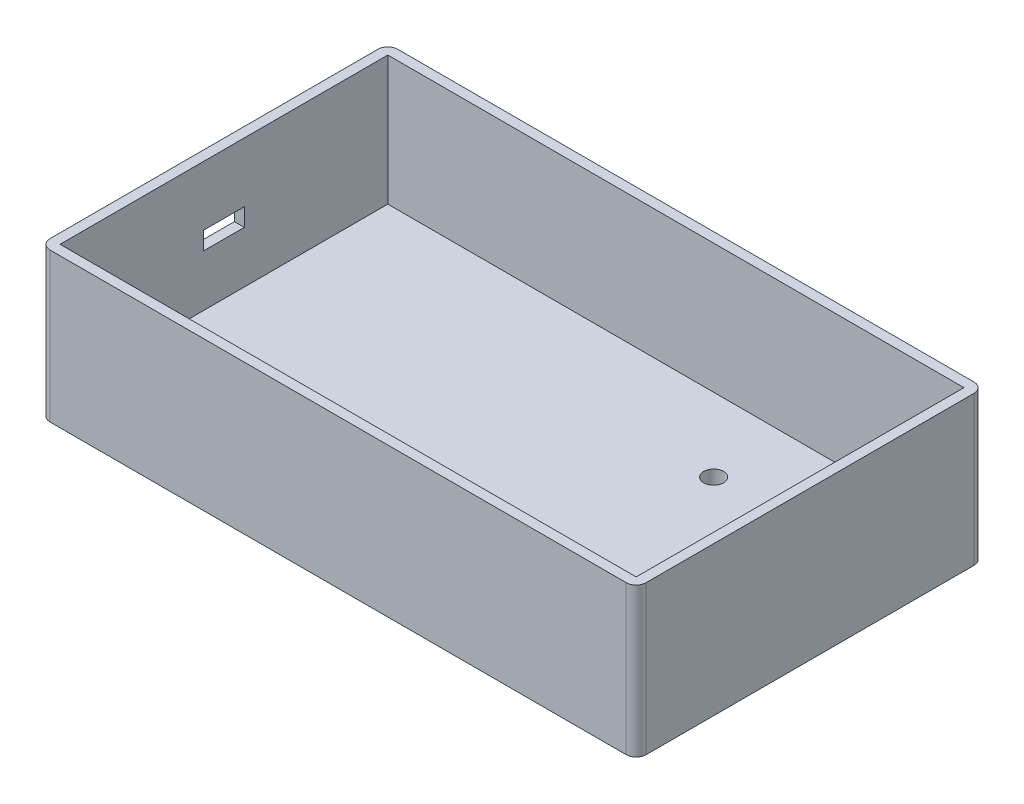
ISO-10303-21;
HEADER;
FILE_DESCRIPTION(('STEP AP214'),'2;1');
FILE_NAME('part.step','',(''),(''),'','','');
FILE_SCHEMA(('AUTOMOTIVE_DESIGN { 1 0 10303 214 1 1 1 1 }'));
ENDSEC;
DATA;
#1=APPLICATION_CONTEXT('core data for automotive mechanical design processes');
#2=APPLICATION_PROTOCOL_DEFINITION('international standard','automotive_design',2000,#1);
#3=PRODUCT_CONTEXT('',#1,'mechanical');
#4=PRODUCT('Part','Part','',(#3));
#5=PRODUCT_RELATED_PRODUCT_CATEGORY('part','',(#4));
#6=PRODUCT_DEFINITION_FORMATION('','',#4);
#7=PRODUCT_DEFINITION_CONTEXT('part definition',#1,'design');
#8=PRODUCT_DEFINITION('design','',#6,#7);
#9=PRODUCT_DEFINITION_SHAPE('','',#8);
#10=(LENGTH_UNIT() NAMED_UNIT(*) SI_UNIT(.MILLI.,.METRE.));
#11=(NAMED_UNIT(*) PLANE_ANGLE_UNIT() SI_UNIT($,.RADIAN.));
#12=(NAMED_UNIT(*) SI_UNIT($,.STERADIAN.) SOLID_ANGLE_UNIT());
#13=UNCERTAINTY_MEASURE_WITH_UNIT(LENGTH_MEASURE(1.E-05),#10,'distance_accuracy_value','');
#14=(GEOMETRIC_REPRESENTATION_CONTEXT(3) GLOBAL_UNCERTAINTY_ASSIGNED_CONTEXT((#13)) GLOBAL_UNIT_ASSIGNED_CONTEXT((#10,
#11,#12)) REPRESENTATION_CONTEXT('',''));
#15=CARTESIAN_POINT('',(0.,0.,0.));
#16=DIRECTION('',(0.,0.,1.));
#17=DIRECTION('',(1.,0.,0.));
#18=AXIS2_PLACEMENT_3D('',#15,#16,#17);
#19=CARTESIAN_POINT('',(76.2,38.1,44.45));
#20=DIRECTION('',(-1.,0.,0.));
#21=DIRECTION('',(0.,0.,1.));
#22=AXIS2_PLACEMENT_3D('',#19,#20,#21);
#23=PLANE('',#22);
#24=DIRECTION('',(0.,0.,-1.));
#25=VECTOR('',#24,1.);
#26=CARTESIAN_POINT('',(76.2,38.1,44.45));
#27=LINE('',#26,#25);
#28=CARTESIAN_POINT('',(76.2,38.1,41.91));
#29=VERTEX_POINT('',#28);
#30=CARTESIAN_POINT('',(76.2,38.1,-41.91));
#31=VERTEX_POINT('',#30);
#32=EDGE_CURVE('E231',#29,#31,#27,.T.);
#33=ORIENTED_EDGE('',*,*,#32,.F.);
#34=DIRECTION('',(0.,-1.,0.));
#35=VECTOR('',#34,1.);
#36=CARTESIAN_POINT('',(76.2,38.1,41.91));
#37=LINE('',#36,#35);
#38=CARTESIAN_POINT('',(76.2,0.,41.91));
#39=VERTEX_POINT('',#38);
#40=EDGE_CURVE('E11',#29,#39,#37,.T.);
#41=ORIENTED_EDGE('',*,*,#40,.T.);
#42=DIRECTION('',(0.,0.,-1.));
#43=VECTOR('',#42,1.);
#44=CARTESIAN_POINT('',(76.2,0.,44.45));
#45=LINE('',#44,#43);
#46=CARTESIAN_POINT('',(76.2,0.,-41.91));
#47=VERTEX_POINT('',#46);
#48=EDGE_CURVE('E224',#39,#47,#45,.T.);
#49=ORIENTED_EDGE('',*,*,#48,.T.);
#50=DIRECTION('',(0.,-1.,0.));
#51=VECTOR('',#50,1.);
#52=CARTESIAN_POINT('',(76.2,38.1,-41.91));
#53=LINE('',#52,#51);
#54=EDGE_CURVE('E53',#47,#31,#53,.F.);
#55=ORIENTED_EDGE('',*,*,#54,.T.);
#56=EDGE_LOOP('',(#33,#41,#49,#55));
#57=FACE_BOUND('',#56,.T.);
#58=ADVANCED_FACE('F45',(#57),#23,.F.);
#59=CARTESIAN_POINT('',(-76.2,38.1,-44.45));
#60=DIRECTION('',(0.,0.,1.));
#61=DIRECTION('',(1.,0.,0.));
#62=AXIS2_PLACEMENT_3D('',#59,#60,#61);
#63=PLANE('',#62);
#64=DIRECTION('',(-1.,0.,0.));
#65=VECTOR('',#64,1.);
#66=CARTESIAN_POINT('',(-76.2,0.,-44.45));
#67=LINE('',#66,#65);
#68=CARTESIAN_POINT('',(73.66,0.,-44.45));
#69=VERTEX_POINT('',#68);
#70=CARTESIAN_POINT('',(-73.66,0.,-44.45));
#71=VERTEX_POINT('',#70);
#72=EDGE_CURVE('E245',#69,#71,#67,.T.);
#73=ORIENTED_EDGE('',*,*,#72,.T.);
#74=DIRECTION('',(0.,-1.,0.));
#75=VECTOR('',#74,1.);
#76=CARTESIAN_POINT('',(-73.66,38.1,-44.45));
#77=LINE('',#76,#75);
#78=CARTESIAN_POINT('',(-73.66,38.1,-44.45));
#79=VERTEX_POINT('',#78);
#80=EDGE_CURVE('E60',#71,#79,#77,.F.);
#81=ORIENTED_EDGE('',*,*,#80,.T.);
#82=DIRECTION('',(-1.,0.,0.));
#83=VECTOR('',#82,1.);
#84=CARTESIAN_POINT('',(-76.2,38.1,-44.45));
#85=LINE('',#84,#83);
#86=CARTESIAN_POINT('',(73.66,38.1,-44.45));
#87=VERTEX_POINT('',#86);
#88=EDGE_CURVE('E233',#87,#79,#85,.T.);
#89=ORIENTED_EDGE('',*,*,#88,.F.);
#90=DIRECTION('',(0.,-1.,0.));
#91=VECTOR('',#90,1.);
#92=CARTESIAN_POINT('',(73.66,38.1,-44.45));
#93=LINE('',#92,#91);
#94=EDGE_CURVE('E276',#87,#69,#93,.T.);
#95=ORIENTED_EDGE('',*,*,#94,.T.);
#96=EDGE_LOOP('',(#73,#81,#89,#95));
#97=FACE_BOUND('',#96,.T.);
#98=ADVANCED_FACE('F289',(#97),#63,.F.);
#99=CARTESIAN_POINT('',(-76.2,38.1,44.45));
#100=DIRECTION('',(1.,0.,0.));
#101=DIRECTION('',(0.,0.,-1.));
#102=AXIS2_PLACEMENT_3D('',#99,#100,#101);
#103=PLANE('',#102);
#104=DIRECTION('',(0.,0.,-1.));
#105=VECTOR('',#104,1.);
#106=CARTESIAN_POINT('',(-76.2,22.86,-5.207));
#107=LINE('',#106,#105);
#108=CARTESIAN_POINT('',(-76.2,22.86,5.207));
#109=VERTEX_POINT('',#108);
#110=CARTESIAN_POINT('',(-76.2,22.86,-5.207));
#111=VERTEX_POINT('',#110);
#112=EDGE_CURVE('E176',#109,#111,#107,.T.);
#113=ORIENTED_EDGE('',*,*,#112,.F.);
#114=DIRECTION('',(0.,1.,0.));
#115=VECTOR('',#114,1.);
#116=CARTESIAN_POINT('',(-76.2,18.288,5.207));
#117=LINE('',#116,#115);
#118=CARTESIAN_POINT('',(-76.2,18.288,5.207));
#119=VERTEX_POINT('',#118);
#120=EDGE_CURVE('E181',#119,#109,#117,.T.);
#121=ORIENTED_EDGE('',*,*,#120,.F.);
#122=DIRECTION('',(0.,0.,1.));
#123=VECTOR('',#122,1.);
#124=CARTESIAN_POINT('',(-76.2,18.288,-5.207));
#125=LINE('',#124,#123);
#126=CARTESIAN_POINT('',(-76.2,18.288,-5.207));
#127=VERTEX_POINT('',#126);
#128=EDGE_CURVE('E186',#127,#119,#125,.T.);
#129=ORIENTED_EDGE('',*,*,#128,.F.);
#130=DIRECTION('',(0.,-1.,0.));
#131=VECTOR('',#130,1.);
#132=CARTESIAN_POINT('',(-76.2,18.288,-5.207));
#133=LINE('',#132,#131);
#134=EDGE_CURVE('E165',#111,#127,#133,.T.);
#135=ORIENTED_EDGE('',*,*,#134,.F.);
#136=EDGE_LOOP('',(#113,#121,#129,#135));
#137=FACE_BOUND('',#136,.T.);
#138=DIRECTION('',(0.,0.,1.));
#139=VECTOR('',#138,1.);
#140=CARTESIAN_POINT('',(-76.2,0.,44.45));
#141=LINE('',#140,#139);
#142=CARTESIAN_POINT('',(-76.2,0.,-41.91));
#143=VERTEX_POINT('',#142);
#144=CARTESIAN_POINT('',(-76.2,0.,41.91));
#145=VERTEX_POINT('',#144);
#146=EDGE_CURVE('E247',#143,#145,#141,.T.);
#147=ORIENTED_EDGE('',*,*,#146,.T.);
#148=DIRECTION('',(0.,-1.,0.));
#149=VECTOR('',#148,1.);
#150=CARTESIAN_POINT('',(-76.2,38.1,41.91));
#151=LINE('',#150,#149);
#152=CARTESIAN_POINT('',(-76.2,38.1,41.91));
#153=VERTEX_POINT('',#152);
#154=EDGE_CURVE('E267',#145,#153,#151,.F.);
#155=ORIENTED_EDGE('',*,*,#154,.T.);
#156=DIRECTION('',(0.,0.,1.));
#157=VECTOR('',#156,1.);
#158=CARTESIAN_POINT('',(-76.2,38.1,44.45));
#159=LINE('',#158,#157);
#160=CARTESIAN_POINT('',(-76.2,38.1,-41.91));
#161=VERTEX_POINT('',#160);
#162=EDGE_CURVE('E236',#161,#153,#159,.T.);
#163=ORIENTED_EDGE('',*,*,#162,.F.);
#164=DIRECTION('',(0.,-1.,0.));
#165=VECTOR('',#164,1.);
#166=CARTESIAN_POINT('',(-76.2,38.1,-41.91));
#167=LINE('',#166,#165);
#168=EDGE_CURVE('E264',#161,#143,#167,.T.);
#169=ORIENTED_EDGE('',*,*,#168,.T.);
#170=EDGE_LOOP('',(#147,#155,#163,#169));
#171=FACE_BOUND('',#170,.T.);
#172=ADVANCED_FACE('F183',(#137,#171),#103,.F.);
#173=CARTESIAN_POINT('',(-76.2,38.1,44.45));
#174=DIRECTION('',(0.,0.,-1.));
#175=DIRECTION('',(-1.,0.,0.));
#176=AXIS2_PLACEMENT_3D('',#173,#174,#175);
#177=PLANE('',#176);
#178=DIRECTION('',(1.,0.,0.));
#179=VECTOR('',#178,1.);
#180=CARTESIAN_POINT('',(-76.2,38.1,44.45));
#181=LINE('',#180,#179);
#182=CARTESIAN_POINT('',(-73.66,38.1,44.45));
#183=VERTEX_POINT('',#182);
#184=CARTESIAN_POINT('',(73.66,38.1,44.45));
#185=VERTEX_POINT('',#184);
#186=EDGE_CURVE('E239',#183,#185,#181,.T.);
#187=ORIENTED_EDGE('',*,*,#186,.F.);
#188=DIRECTION('',(0.,-1.,0.));
#189=VECTOR('',#188,1.);
#190=CARTESIAN_POINT('',(-73.66,38.1,44.45));
#191=LINE('',#190,#189);
#192=CARTESIAN_POINT('',(-73.66,0.,44.45));
#193=VERTEX_POINT('',#192);
#194=EDGE_CURVE('E253',#183,#193,#191,.T.);
#195=ORIENTED_EDGE('',*,*,#194,.T.);
#196=DIRECTION('',(1.,0.,0.));
#197=VECTOR('',#196,1.);
#198=CARTESIAN_POINT('',(-76.2,0.,44.45));
#199=LINE('',#198,#197);
#200=CARTESIAN_POINT('',(73.66,0.,44.45));
#201=VERTEX_POINT('',#200);
#202=EDGE_CURVE('E234',#193,#201,#199,.T.);
#203=ORIENTED_EDGE('',*,*,#202,.T.);
#204=DIRECTION('',(0.,-1.,0.));
#205=VECTOR('',#204,1.);
#206=CARTESIAN_POINT('',(73.66,38.1,44.45));
#207=LINE('',#206,#205);
#208=EDGE_CURVE('E242',#201,#185,#207,.F.);
#209=ORIENTED_EDGE('',*,*,#208,.T.);
#210=EDGE_LOOP('',(#187,#195,#203,#209));
#211=FACE_BOUND('',#210,.T.);
#212=ADVANCED_FACE('F306',(#211),#177,.F.);
#213=CARTESIAN_POINT('',(0.,38.1,0.));
#214=DIRECTION('',(0.,-1.,0.));
#215=DIRECTION('',(0.,0.,-1.));
#216=AXIS2_PLACEMENT_3D('',#213,#214,#215);
#217=PLANE('',#216);
#218=DIRECTION('',(-1.,0.,0.));
#219=VECTOR('',#218,1.);
#220=CARTESIAN_POINT('',(-73.66,38.1,-41.91));
#221=LINE('',#220,#219);
#222=CARTESIAN_POINT('',(73.66,38.1,-41.91));
#223=VERTEX_POINT('',#222);
#224=CARTESIAN_POINT('',(-73.66,38.1,-41.91));
#225=VERTEX_POINT('',#224);
#226=EDGE_CURVE('E214',#223,#225,#221,.T.);
#227=ORIENTED_EDGE('',*,*,#226,.F.);
#228=DIRECTION('',(0.,0.,-1.));
#229=VECTOR('',#228,1.);
#230=CARTESIAN_POINT('',(73.66,38.1,41.91));
#231=LINE('',#230,#229);
#232=CARTESIAN_POINT('',(73.66,38.1,41.91));
#233=VERTEX_POINT('',#232);
#234=EDGE_CURVE('E197',#233,#223,#231,.T.);
#235=ORIENTED_EDGE('',*,*,#234,.F.);
#236=DIRECTION('',(1.,0.,0.));
#237=VECTOR('',#236,1.);
#238=CARTESIAN_POINT('',(-73.66,38.1,41.91));
#239=LINE('',#238,#237);
#240=CARTESIAN_POINT('',(-73.66,38.1,41.91));
#241=VERTEX_POINT('',#240);
#242=EDGE_CURVE('E203',#241,#233,#239,.T.);
#243=ORIENTED_EDGE('',*,*,#242,.F.);
#244=DIRECTION('',(0.,0.,1.));
#245=VECTOR('',#244,1.);
#246=CARTESIAN_POINT('',(-73.66,38.1,41.91));
#247=LINE('',#246,#245);
#248=EDGE_CURVE('E217',#225,#241,#247,.T.);
#249=ORIENTED_EDGE('',*,*,#248,.F.);
#250=EDGE_LOOP('',(#227,#235,#243,#249));
#251=FACE_BOUND('',#250,.T.);
#252=ORIENTED_EDGE('',*,*,#162,.T.);
#253=CARTESIAN_POINT('',(-73.66,38.1,41.91));
#254=DIRECTION('',(0.,-1.,0.));
#255=DIRECTION('',(0.,0.,-1.));
#256=AXIS2_PLACEMENT_3D('',#253,#254,#255);
#257=CIRCLE('',#256,2.54);
#258=EDGE_CURVE('E274',#153,#183,#257,.F.);
#259=ORIENTED_EDGE('',*,*,#258,.T.);
#260=ORIENTED_EDGE('',*,*,#186,.T.);
#261=CARTESIAN_POINT('',(73.66,38.1,41.91));
#262=DIRECTION('',(0.,-1.,0.));
#263=DIRECTION('',(0.,0.,-1.));
#264=AXIS2_PLACEMENT_3D('',#261,#262,#263);
#265=CIRCLE('',#264,2.54);
#266=EDGE_CURVE('E270',#185,#29,#265,.F.);
#267=ORIENTED_EDGE('',*,*,#266,.T.);
#268=ORIENTED_EDGE('',*,*,#32,.T.);
#269=CARTESIAN_POINT('',(73.66,38.1,-41.91));
#270=DIRECTION('',(0.,-1.,0.));
#271=DIRECTION('',(0.,0.,-1.));
#272=AXIS2_PLACEMENT_3D('',#269,#270,#271);
#273=CIRCLE('',#272,2.54);
#274=EDGE_CURVE('E67',#31,#87,#273,.F.);
#275=ORIENTED_EDGE('',*,*,#274,.T.);
#276=ORIENTED_EDGE('',*,*,#88,.T.);
#277=CARTESIAN_POINT('',(-73.66,38.1,-41.91));
#278=DIRECTION('',(0.,-1.,0.));
#279=DIRECTION('',(0.,0.,-1.));
#280=AXIS2_PLACEMENT_3D('',#277,#278,#279);
#281=CIRCLE('',#280,2.54);
#282=EDGE_CURVE('E272',#79,#161,#281,.F.);
#283=ORIENTED_EDGE('',*,*,#282,.T.);
#284=EDGE_LOOP('',(#252,#259,#260,#267,#268,#275,#276,#283));
#285=FACE_BOUND('',#284,.T.);
#286=ADVANCED_FACE('F285',(#251,#285),#217,.F.);
#287=CARTESIAN_POINT('',(0.,0.,0.));
#288=DIRECTION('',(0.,-1.,0.));
#289=DIRECTION('',(0.,0.,-1.));
#290=AXIS2_PLACEMENT_3D('',#287,#288,#289);
#291=PLANE('',#290);
#292=CARTESIAN_POINT('',(28.448,0.,-23.114));
#293=DIRECTION('',(0.,1.,0.));
#294=DIRECTION('',(0.,0.,1.));
#295=AXIS2_PLACEMENT_3D('',#292,#293,#294);
#296=CIRCLE('',#295,2.54);
#297=CARTESIAN_POINT('',(28.448,0.,-20.574));
#298=VERTEX_POINT('',#297);
#299=EDGE_CURVE('E489',#298,#298,#296,.T.);
#300=ORIENTED_EDGE('',*,*,#299,.T.);
#301=EDGE_LOOP('',(#300));
#302=FACE_BOUND('',#301,.T.);
#303=CARTESIAN_POINT('',(28.448,0.,23.114));
#304=DIRECTION('',(0.,1.,0.));
#305=DIRECTION('',(0.,0.,-1.));
#306=AXIS2_PLACEMENT_3D('',#303,#304,#305);
#307=CIRCLE('',#306,2.54);
#308=CARTESIAN_POINT('',(28.448,0.,20.574));
#309=VERTEX_POINT('',#308);
#310=EDGE_CURVE('E497',#309,#309,#307,.T.);
#311=ORIENTED_EDGE('',*,*,#310,.T.);
#312=EDGE_LOOP('',(#311));
#313=FACE_BOUND('',#312,.T.);
#314=ORIENTED_EDGE('',*,*,#202,.F.);
#315=CARTESIAN_POINT('',(-73.66,0.,41.91));
#316=DIRECTION('',(0.,-1.,0.));
#317=DIRECTION('',(0.,0.,-1.));
#318=AXIS2_PLACEMENT_3D('',#315,#316,#317);
#319=CIRCLE('',#318,2.54);
#320=EDGE_CURVE('E262',#193,#145,#319,.T.);
#321=ORIENTED_EDGE('',*,*,#320,.T.);
#322=ORIENTED_EDGE('',*,*,#146,.F.);
#323=CARTESIAN_POINT('',(-73.66,0.,-41.91));
#324=DIRECTION('',(0.,-1.,0.));
#325=DIRECTION('',(0.,0.,-1.));
#326=AXIS2_PLACEMENT_3D('',#323,#324,#325);
#327=CIRCLE('',#326,2.54);
#328=EDGE_CURVE('E260',#143,#71,#327,.T.);
#329=ORIENTED_EDGE('',*,*,#328,.T.);
#330=ORIENTED_EDGE('',*,*,#72,.F.);
#331=CARTESIAN_POINT('',(73.66,0.,-41.91));
#332=DIRECTION('',(0.,-1.,0.));
#333=DIRECTION('',(0.,0.,-1.));
#334=AXIS2_PLACEMENT_3D('',#331,#332,#333);
#335=CIRCLE('',#334,2.54);
#336=EDGE_CURVE('E256',#69,#47,#335,.T.);
#337=ORIENTED_EDGE('',*,*,#336,.T.);
#338=ORIENTED_EDGE('',*,*,#48,.F.);
#339=CARTESIAN_POINT('',(73.66,0.,41.91));
#340=DIRECTION('',(0.,-1.,0.));
#341=DIRECTION('',(0.,0.,-1.));
#342=AXIS2_PLACEMENT_3D('',#339,#340,#341);
#343=CIRCLE('',#342,2.54);
#344=EDGE_CURVE('E258',#39,#201,#343,.T.);
#345=ORIENTED_EDGE('',*,*,#344,.T.);
#346=EDGE_LOOP('',(#314,#321,#322,#329,#330,#337,#338,#345));
#347=FACE_BOUND('',#346,.T.);
#348=ADVANCED_FACE('F292',(#302,#313,#347),#291,.T.);
#349=CARTESIAN_POINT('',(73.66,5.08,41.91));
#350=DIRECTION('',(1.,0.,0.));
#351=DIRECTION('',(0.,0.,-1.));
#352=AXIS2_PLACEMENT_3D('',#349,#350,#351);
#353=PLANE('',#352);
#354=ORIENTED_EDGE('',*,*,#234,.T.);
#355=DIRECTION('',(0.,1.,0.));
#356=VECTOR('',#355,1.);
#357=CARTESIAN_POINT('',(73.66,5.08,-41.91));
#358=LINE('',#357,#356);
#359=CARTESIAN_POINT('',(73.66,5.08,-41.91));
#360=VERTEX_POINT('',#359);
#361=EDGE_CURVE('E212',#360,#223,#358,.T.);
#362=ORIENTED_EDGE('',*,*,#361,.F.);
#363=DIRECTION('',(0.,0.,-1.));
#364=VECTOR('',#363,1.);
#365=CARTESIAN_POINT('',(73.66,5.08,41.91));
#366=LINE('',#365,#364);
#367=CARTESIAN_POINT('',(73.66,5.08,41.91));
#368=VERTEX_POINT('',#367);
#369=EDGE_CURVE('E199',#368,#360,#366,.T.);
#370=ORIENTED_EDGE('',*,*,#369,.F.);
#371=DIRECTION('',(0.,1.,0.));
#372=VECTOR('',#371,1.);
#373=CARTESIAN_POINT('',(73.66,5.08,41.91));
#374=LINE('',#373,#372);
#375=EDGE_CURVE('E222',#368,#233,#374,.T.);
#376=ORIENTED_EDGE('',*,*,#375,.T.);
#377=EDGE_LOOP('',(#354,#362,#370,#376));
#378=FACE_BOUND('',#377,.T.);
#379=ADVANCED_FACE('F351',(#378),#353,.F.);
#380=CARTESIAN_POINT('',(-73.66,5.08,41.91));
#381=DIRECTION('',(0.,0.,1.));
#382=DIRECTION('',(1.,0.,0.));
#383=AXIS2_PLACEMENT_3D('',#380,#381,#382);
#384=PLANE('',#383);
#385=ORIENTED_EDGE('',*,*,#242,.T.);
#386=ORIENTED_EDGE('',*,*,#375,.F.);
#387=DIRECTION('',(1.,0.,0.));
#388=VECTOR('',#387,1.);
#389=CARTESIAN_POINT('',(-73.66,5.08,41.91));
#390=LINE('',#389,#388);
#391=CARTESIAN_POINT('',(-73.66,5.08,41.91));
#392=VERTEX_POINT('',#391);
#393=EDGE_CURVE('E209',#392,#368,#390,.T.);
#394=ORIENTED_EDGE('',*,*,#393,.F.);
#395=DIRECTION('',(0.,1.,0.));
#396=VECTOR('',#395,1.);
#397=CARTESIAN_POINT('',(-73.66,5.08,41.91));
#398=LINE('',#397,#396);
#399=EDGE_CURVE('E225',#392,#241,#398,.T.);
#400=ORIENTED_EDGE('',*,*,#399,.T.);
#401=EDGE_LOOP('',(#385,#386,#394,#400));
#402=FACE_BOUND('',#401,.T.);
#403=ADVANCED_FACE('F347',(#402),#384,.F.);
#404=CARTESIAN_POINT('',(-73.66,5.08,41.91));
#405=DIRECTION('',(-1.,0.,0.));
#406=DIRECTION('',(0.,0.,1.));
#407=AXIS2_PLACEMENT_3D('',#404,#405,#406);
#408=PLANE('',#407);
#409=DIRECTION('',(0.,0.,-1.));
#410=VECTOR('',#409,1.);
#411=CARTESIAN_POINT('',(-73.66,18.288,-5.207));
#412=LINE('',#411,#410);
#413=CARTESIAN_POINT('',(-73.66,18.288,5.207));
#414=VERTEX_POINT('',#413);
#415=CARTESIAN_POINT('',(-73.66,18.288,-5.207));
#416=VERTEX_POINT('',#415);
#417=EDGE_CURVE('E503',#414,#416,#412,.T.);
#418=ORIENTED_EDGE('',*,*,#417,.F.);
#419=DIRECTION('',(0.,-1.,0.));
#420=VECTOR('',#419,1.);
#421=CARTESIAN_POINT('',(-73.66,18.288,5.207));
#422=LINE('',#421,#420);
#423=CARTESIAN_POINT('',(-73.66,22.86,5.207));
#424=VERTEX_POINT('',#423);
#425=EDGE_CURVE('E198',#424,#414,#422,.T.);
#426=ORIENTED_EDGE('',*,*,#425,.F.);
#427=DIRECTION('',(0.,0.,1.));
#428=VECTOR('',#427,1.);
#429=CARTESIAN_POINT('',(-73.66,22.86,-5.207));
#430=LINE('',#429,#428);
#431=CARTESIAN_POINT('',(-73.66,22.86,-5.207));
#432=VERTEX_POINT('',#431);
#433=EDGE_CURVE('E195',#432,#424,#430,.T.);
#434=ORIENTED_EDGE('',*,*,#433,.F.);
#435=DIRECTION('',(0.,1.,0.));
#436=VECTOR('',#435,1.);
#437=CARTESIAN_POINT('',(-73.66,18.288,-5.207));
#438=LINE('',#437,#436);
#439=EDGE_CURVE('E168',#416,#432,#438,.T.);
#440=ORIENTED_EDGE('',*,*,#439,.F.);
#441=EDGE_LOOP('',(#418,#426,#434,#440));
#442=FACE_BOUND('',#441,.T.);
#443=ORIENTED_EDGE('',*,*,#248,.T.);
#444=ORIENTED_EDGE('',*,*,#399,.F.);
#445=DIRECTION('',(0.,0.,1.));
#446=VECTOR('',#445,1.);
#447=CARTESIAN_POINT('',(-73.66,5.08,41.91));
#448=LINE('',#447,#446);
#449=CARTESIAN_POINT('',(-73.66,5.08,-41.91));
#450=VERTEX_POINT('',#449);
#451=EDGE_CURVE('E206',#450,#392,#448,.T.);
#452=ORIENTED_EDGE('',*,*,#451,.F.);
#453=DIRECTION('',(0.,1.,0.));
#454=VECTOR('',#453,1.);
#455=CARTESIAN_POINT('',(-73.66,5.08,-41.91));
#456=LINE('',#455,#454);
#457=EDGE_CURVE('E227',#450,#225,#456,.T.);
#458=ORIENTED_EDGE('',*,*,#457,.T.);
#459=EDGE_LOOP('',(#443,#444,#452,#458));
#460=FACE_BOUND('',#459,.T.);
#461=ADVANCED_FACE('F350',(#442,#460),#408,.F.);
#462=CARTESIAN_POINT('',(-73.66,5.08,-41.91));
#463=DIRECTION('',(0.,0.,-1.));
#464=DIRECTION('',(-1.,0.,0.));
#465=AXIS2_PLACEMENT_3D('',#462,#463,#464);
#466=PLANE('',#465);
#467=ORIENTED_EDGE('',*,*,#226,.T.);
#468=ORIENTED_EDGE('',*,*,#457,.F.);
#469=DIRECTION('',(-1.,0.,0.));
#470=VECTOR('',#469,1.);
#471=CARTESIAN_POINT('',(-73.66,5.08,-41.91));
#472=LINE('',#471,#470);
#473=EDGE_CURVE('E202',#360,#450,#472,.T.);
#474=ORIENTED_EDGE('',*,*,#473,.F.);
#475=ORIENTED_EDGE('',*,*,#361,.T.);
#476=EDGE_LOOP('',(#467,#468,#474,#475));
#477=FACE_BOUND('',#476,.T.);
#478=ADVANCED_FACE('F345',(#477),#466,.F.);
#479=CARTESIAN_POINT('',(0.,5.08,0.));
#480=DIRECTION('',(0.,-1.,0.));
#481=DIRECTION('',(0.,0.,-1.));
#482=AXIS2_PLACEMENT_3D('',#479,#480,#481);
#483=PLANE('',#482);
#484=CARTESIAN_POINT('',(28.448,5.08,-23.114));
#485=DIRECTION('',(0.,1.,0.));
#486=DIRECTION('',(0.,0.,1.));
#487=AXIS2_PLACEMENT_3D('',#484,#485,#486);
#488=CIRCLE('',#487,2.54);
#489=CARTESIAN_POINT('',(28.448,5.08,-20.574));
#490=VERTEX_POINT('',#489);
#491=EDGE_CURVE('E492',#490,#490,#488,.T.);
#492=ORIENTED_EDGE('',*,*,#491,.F.);
#493=EDGE_LOOP('',(#492));
#494=FACE_BOUND('',#493,.T.);
#495=CARTESIAN_POINT('',(28.448,5.08,23.114));
#496=DIRECTION('',(0.,1.,0.));
#497=DIRECTION('',(0.,0.,-1.));
#498=AXIS2_PLACEMENT_3D('',#495,#496,#497);
#499=CIRCLE('',#498,2.54);
#500=CARTESIAN_POINT('',(28.448,5.08,20.574));
#501=VERTEX_POINT('',#500);
#502=EDGE_CURVE('E493',#501,#501,#499,.T.);
#503=ORIENTED_EDGE('',*,*,#502,.F.);
#504=EDGE_LOOP('',(#503));
#505=FACE_BOUND('',#504,.T.);
#506=ORIENTED_EDGE('',*,*,#369,.T.);
#507=ORIENTED_EDGE('',*,*,#473,.T.);
#508=ORIENTED_EDGE('',*,*,#451,.T.);
#509=ORIENTED_EDGE('',*,*,#393,.T.);
#510=EDGE_LOOP('',(#506,#507,#508,#509));
#511=FACE_BOUND('',#510,.T.);
#512=ADVANCED_FACE('F341',(#494,#505,#511),#483,.F.);
#513=CARTESIAN_POINT('',(-62.286584505963,18.288,5.207));
#514=DIRECTION('',(0.,0.,1.));
#515=DIRECTION('',(1.,0.,0.));
#516=AXIS2_PLACEMENT_3D('',#513,#514,#515);
#517=PLANE('',#516);
#518=ORIENTED_EDGE('',*,*,#425,.T.);
#519=DIRECTION('',(-1.,0.,0.));
#520=VECTOR('',#519,1.);
#521=CARTESIAN_POINT('',(-62.286584505963,18.288,5.207));
#522=LINE('',#521,#520);
#523=EDGE_CURVE('E191',#414,#119,#522,.T.);
#524=ORIENTED_EDGE('',*,*,#523,.T.);
#525=ORIENTED_EDGE('',*,*,#120,.T.);
#526=DIRECTION('',(-1.,0.,0.));
#527=VECTOR('',#526,1.);
#528=CARTESIAN_POINT('',(-62.286584505963,22.86,5.207));
#529=LINE('',#528,#527);
#530=EDGE_CURVE('E172',#424,#109,#529,.T.);
#531=ORIENTED_EDGE('',*,*,#530,.F.);
#532=EDGE_LOOP('',(#518,#524,#525,#531));
#533=FACE_BOUND('',#532,.T.);
#534=ADVANCED_FACE('F338',(#533),#517,.F.);
#535=CARTESIAN_POINT('',(-62.286584505963,18.288,-5.207));
#536=DIRECTION('',(0.,-1.,0.));
#537=DIRECTION('',(0.,0.,-1.));
#538=AXIS2_PLACEMENT_3D('',#535,#536,#537);
#539=PLANE('',#538);
#540=ORIENTED_EDGE('',*,*,#417,.T.);
#541=DIRECTION('',(-1.,0.,0.));
#542=VECTOR('',#541,1.);
#543=CARTESIAN_POINT('',(-62.286584505963,18.288,-5.207));
#544=LINE('',#543,#542);
#545=EDGE_CURVE('E171',#416,#127,#544,.T.);
#546=ORIENTED_EDGE('',*,*,#545,.T.);
#547=ORIENTED_EDGE('',*,*,#128,.T.);
#548=ORIENTED_EDGE('',*,*,#523,.F.);
#549=EDGE_LOOP('',(#540,#546,#547,#548));
#550=FACE_BOUND('',#549,.T.);
#551=ADVANCED_FACE('F334',(#550),#539,.F.);
#552=CARTESIAN_POINT('',(-62.286584505963,18.288,-5.207));
#553=DIRECTION('',(0.,0.,-1.));
#554=DIRECTION('',(-1.,0.,0.));
#555=AXIS2_PLACEMENT_3D('',#552,#553,#554);
#556=PLANE('',#555);
#557=ORIENTED_EDGE('',*,*,#439,.T.);
#558=DIRECTION('',(-1.,0.,0.));
#559=VECTOR('',#558,1.);
#560=CARTESIAN_POINT('',(-62.286584505963,22.86,-5.207));
#561=LINE('',#560,#559);
#562=EDGE_CURVE('E160',#432,#111,#561,.T.);
#563=ORIENTED_EDGE('',*,*,#562,.T.);
#564=ORIENTED_EDGE('',*,*,#134,.T.);
#565=ORIENTED_EDGE('',*,*,#545,.F.);
#566=EDGE_LOOP('',(#557,#563,#564,#565));
#567=FACE_BOUND('',#566,.T.);
#568=ADVANCED_FACE('F162',(#567),#556,.F.);
#569=CARTESIAN_POINT('',(-62.286584505963,22.86,-5.207));
#570=DIRECTION('',(0.,1.,0.));
#571=DIRECTION('',(0.,0.,1.));
#572=AXIS2_PLACEMENT_3D('',#569,#570,#571);
#573=PLANE('',#572);
#574=ORIENTED_EDGE('',*,*,#433,.T.);
#575=ORIENTED_EDGE('',*,*,#530,.T.);
#576=ORIENTED_EDGE('',*,*,#112,.T.);
#577=ORIENTED_EDGE('',*,*,#562,.F.);
#578=EDGE_LOOP('',(#574,#575,#576,#577));
#579=FACE_BOUND('',#578,.T.);
#580=ADVANCED_FACE('F177',(#579),#573,.F.);
#581=CARTESIAN_POINT('',(-73.66,38.1,41.91));
#582=DIRECTION('',(0.,-1.,0.));
#583=DIRECTION('',(0.,0.,-1.));
#584=AXIS2_PLACEMENT_3D('',#581,#582,#583);
#585=CYLINDRICAL_SURFACE('',#584,2.54);
#586=ORIENTED_EDGE('',*,*,#258,.F.);
#587=ORIENTED_EDGE('',*,*,#154,.F.);
#588=ORIENTED_EDGE('',*,*,#320,.F.);
#589=ORIENTED_EDGE('',*,*,#194,.F.);
#590=EDGE_LOOP('',(#586,#587,#588,#589));
#591=FACE_BOUND('',#590,.T.);
#592=ADVANCED_FACE('F304',(#591),#585,.T.);
#593=CARTESIAN_POINT('',(-73.66,38.1,-41.91));
#594=DIRECTION('',(0.,-1.,0.));
#595=DIRECTION('',(0.,0.,-1.));
#596=AXIS2_PLACEMENT_3D('',#593,#594,#595);
#597=CYLINDRICAL_SURFACE('',#596,2.54);
#598=ORIENTED_EDGE('',*,*,#282,.F.);
#599=ORIENTED_EDGE('',*,*,#80,.F.);
#600=ORIENTED_EDGE('',*,*,#328,.F.);
#601=ORIENTED_EDGE('',*,*,#168,.F.);
#602=EDGE_LOOP('',(#598,#599,#600,#601));
#603=FACE_BOUND('',#602,.T.);
#604=ADVANCED_FACE('F297',(#603),#597,.T.);
#605=CARTESIAN_POINT('',(73.66,38.1,41.91));
#606=DIRECTION('',(0.,-1.,0.));
#607=DIRECTION('',(0.,0.,-1.));
#608=AXIS2_PLACEMENT_3D('',#605,#606,#607);
#609=CYLINDRICAL_SURFACE('',#608,2.54);
#610=ORIENTED_EDGE('',*,*,#266,.F.);
#611=ORIENTED_EDGE('',*,*,#208,.F.);
#612=ORIENTED_EDGE('',*,*,#344,.F.);
#613=ORIENTED_EDGE('',*,*,#40,.F.);
#614=EDGE_LOOP('',(#610,#611,#612,#613));
#615=FACE_BOUND('',#614,.T.);
#616=ADVANCED_FACE('F309',(#615),#609,.T.);
#617=CARTESIAN_POINT('',(73.66,38.1,-41.91));
#618=DIRECTION('',(0.,-1.,0.));
#619=DIRECTION('',(0.,0.,-1.));
#620=AXIS2_PLACEMENT_3D('',#617,#618,#619);
#621=CYLINDRICAL_SURFACE('',#620,2.54);
#622=ORIENTED_EDGE('',*,*,#274,.F.);
#623=ORIENTED_EDGE('',*,*,#54,.F.);
#624=ORIENTED_EDGE('',*,*,#336,.F.);
#625=ORIENTED_EDGE('',*,*,#94,.F.);
#626=EDGE_LOOP('',(#622,#623,#624,#625));
#627=FACE_BOUND('',#626,.T.);
#628=ADVANCED_FACE('F47',(#627),#621,.T.);
#629=CARTESIAN_POINT('',(28.448,0.,23.114));
#630=DIRECTION('',(0.,1.,0.));
#631=DIRECTION('',(0.,0.,1.));
#632=AXIS2_PLACEMENT_3D('',#629,#630,#631);
#633=CYLINDRICAL_SURFACE('',#632,2.54);
#634=ORIENTED_EDGE('',*,*,#310,.F.);
#635=EDGE_LOOP('',(#634));
#636=FACE_BOUND('',#635,.T.);
#637=ORIENTED_EDGE('',*,*,#502,.T.);
#638=EDGE_LOOP('',(#637));
#639=FACE_BOUND('',#638,.T.);
#640=ADVANCED_FACE('F315',(#636,#639),#633,.F.);
#641=CARTESIAN_POINT('',(28.448,0.,-23.114));
#642=DIRECTION('',(0.,1.,0.));
#643=DIRECTION('',(0.,0.,1.));
#644=AXIS2_PLACEMENT_3D('',#641,#642,#643);
#645=CYLINDRICAL_SURFACE('',#644,2.54);
#646=ORIENTED_EDGE('',*,*,#299,.F.);
#647=EDGE_LOOP('',(#646));
#648=FACE_BOUND('',#647,.T.);
#649=ORIENTED_EDGE('',*,*,#491,.T.);
#650=EDGE_LOOP('',(#649));
#651=FACE_BOUND('',#650,.T.);
#652=ADVANCED_FACE('F473',(#648,#651),#645,.F.);
#653=CLOSED_SHELL('',(#58,#98,#172,#212,#286,#348,#379,#403,#461,#478,#512,#534,#551,#568,#580,
#592,#604,#616,#628,#640,#652));
#654=MANIFOLD_SOLID_BREP('B2',#653);
#655=ADVANCED_BREP_SHAPE_REPRESENTATION('',(#18,#654),#14);
#656=SHAPE_DEFINITION_REPRESENTATION(#9,#655);
ENDSEC;
END-ISO-10303-21;
